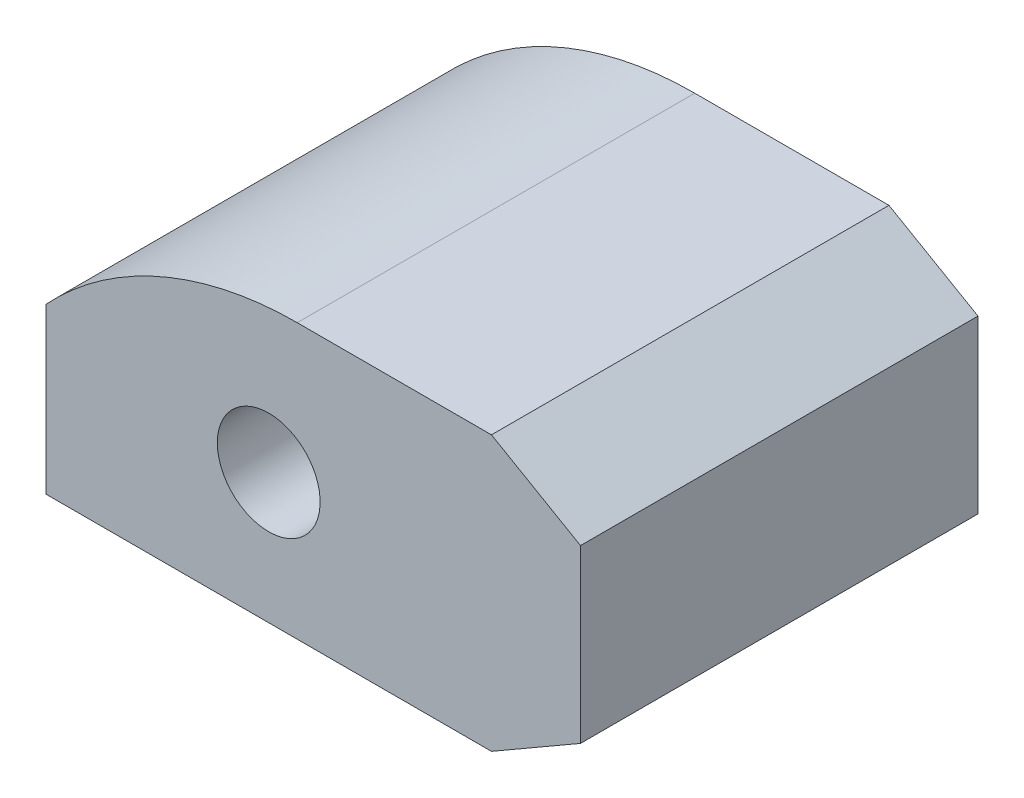
ISO-10303-21;
HEADER;
FILE_DESCRIPTION(('STEP AP214'),'2;1');
FILE_NAME('part.step','',(''),(''),'','','');
FILE_SCHEMA(('AUTOMOTIVE_DESIGN { 1 0 10303 214 1 1 1 1 }'));
ENDSEC;
DATA;
#1=APPLICATION_CONTEXT('core data for automotive mechanical design processes');
#2=APPLICATION_PROTOCOL_DEFINITION('international standard','automotive_design',2000,#1);
#3=PRODUCT_CONTEXT('',#1,'mechanical');
#4=PRODUCT('Part','Part','',(#3));
#5=PRODUCT_RELATED_PRODUCT_CATEGORY('part','',(#4));
#6=PRODUCT_DEFINITION_FORMATION('','',#4);
#7=PRODUCT_DEFINITION_CONTEXT('part definition',#1,'design');
#8=PRODUCT_DEFINITION('design','',#6,#7);
#9=PRODUCT_DEFINITION_SHAPE('','',#8);
#10=(LENGTH_UNIT() NAMED_UNIT(*) SI_UNIT(.MILLI.,.METRE.));
#11=(NAMED_UNIT(*) PLANE_ANGLE_UNIT() SI_UNIT($,.RADIAN.));
#12=(NAMED_UNIT(*) SI_UNIT($,.STERADIAN.) SOLID_ANGLE_UNIT());
#13=UNCERTAINTY_MEASURE_WITH_UNIT(LENGTH_MEASURE(1.E-05),#10,'distance_accuracy_value','');
#14=(GEOMETRIC_REPRESENTATION_CONTEXT(3) GLOBAL_UNCERTAINTY_ASSIGNED_CONTEXT((#13)) GLOBAL_UNIT_ASSIGNED_CONTEXT((#10,
#11,#12)) REPRESENTATION_CONTEXT('',''));
#15=CARTESIAN_POINT('',(0.,0.,0.));
#16=DIRECTION('',(0.,0.,1.));
#17=DIRECTION('',(1.,0.,0.));
#18=AXIS2_PLACEMENT_3D('',#15,#16,#17);
#19=CARTESIAN_POINT('',(4.16060555964673,-29.,58.));
#20=DIRECTION('',(0.,0.,-1.));
#21=DIRECTION('',(-1.,0.,0.));
#22=AXIS2_PLACEMENT_3D('',#19,#20,#21);
#23=PLANE('',#22);
#24=CARTESIAN_POINT('',(4.16060555964673,-29.,58.));
#25=DIRECTION('',(0.,0.,1.));
#26=DIRECTION('',(-1.,0.,0.));
#27=AXIS2_PLACEMENT_3D('',#24,#25,#26);
#28=CIRCLE('',#27,50.);
#29=CARTESIAN_POINT('',(4.16060555964673,21.,58.));
#30=VERTEX_POINT('',#29);
#31=CARTESIAN_POINT('',(-32.5,5.,58.));
#32=VERTEX_POINT('',#31);
#33=EDGE_CURVE('E161',#30,#32,#28,.T.);
#34=ORIENTED_EDGE('',*,*,#33,.T.);
#35=DIRECTION('',(0.,-1.,0.));
#36=VECTOR('',#35,1.);
#37=CARTESIAN_POINT('',(-32.5,-19.,58.));
#38=LINE('',#37,#36);
#39=CARTESIAN_POINT('',(-32.5,-19.,58.));
#40=VERTEX_POINT('',#39);
#41=EDGE_CURVE('E103',#32,#40,#38,.T.);
#42=ORIENTED_EDGE('',*,*,#41,.T.);
#43=DIRECTION('',(1.,0.,0.));
#44=VECTOR('',#43,1.);
#45=CARTESIAN_POINT('',(32.5,-19.,58.));
#46=LINE('',#45,#44);
#47=CARTESIAN_POINT('',(32.5,-19.,58.));
#48=VERTEX_POINT('',#47);
#49=EDGE_CURVE('E178',#40,#48,#46,.T.);
#50=ORIENTED_EDGE('',*,*,#49,.T.);
#51=DIRECTION('',(0.866025403784438,0.500000000000001,0.));
#52=VECTOR('',#51,1.);
#53=CARTESIAN_POINT('',(32.5,-19.,58.));
#54=LINE('',#53,#52);
#55=CARTESIAN_POINT('',(45.4903810567666,-11.5,58.));
#56=VERTEX_POINT('',#55);
#57=EDGE_CURVE('E119',#48,#56,#54,.T.);
#58=ORIENTED_EDGE('',*,*,#57,.T.);
#59=DIRECTION('',(0.,1.,0.));
#60=VECTOR('',#59,1.);
#61=CARTESIAN_POINT('',(45.4903810567666,-11.5,58.));
#62=LINE('',#61,#60);
#63=CARTESIAN_POINT('',(45.4903810567666,13.5000000000001,58.));
#64=VERTEX_POINT('',#63);
#65=EDGE_CURVE('E113',#56,#64,#62,.T.);
#66=ORIENTED_EDGE('',*,*,#65,.T.);
#67=DIRECTION('',(-0.866025403784442,0.499999999999995,0.));
#68=VECTOR('',#67,1.);
#69=CARTESIAN_POINT('',(45.4903810567666,13.5000000000001,58.));
#70=LINE('',#69,#68);
#71=CARTESIAN_POINT('',(32.5,21.,58.));
#72=VERTEX_POINT('',#71);
#73=EDGE_CURVE('E117',#64,#72,#70,.T.);
#74=ORIENTED_EDGE('',*,*,#73,.T.);
#75=DIRECTION('',(-1.,0.,0.));
#76=VECTOR('',#75,1.);
#77=CARTESIAN_POINT('',(32.5,21.,58.));
#78=LINE('',#77,#76);
#79=EDGE_CURVE('E63',#72,#30,#78,.T.);
#80=ORIENTED_EDGE('',*,*,#79,.T.);
#81=EDGE_LOOP('',(#34,#42,#50,#58,#66,#74,#80));
#82=FACE_BOUND('',#81,.T.);
#83=CARTESIAN_POINT('',(0.,0.,58.));
#84=DIRECTION('',(0.,0.,1.));
#85=DIRECTION('',(1.,0.,0.));
#86=AXIS2_PLACEMENT_3D('',#83,#84,#85);
#87=CIRCLE('',#86,7.5);
#88=CARTESIAN_POINT('',(-7.5,0.,58.));
#89=VERTEX_POINT('',#88);
#90=EDGE_CURVE('E146',#89,#89,#87,.T.);
#91=ORIENTED_EDGE('',*,*,#90,.F.);
#92=EDGE_LOOP('',(#91));
#93=FACE_BOUND('',#92,.T.);
#94=ADVANCED_FACE('F45',(#82,#93),#23,.F.);
#95=CARTESIAN_POINT('',(4.16060555964673,-29.,0.));
#96=DIRECTION('',(0.,0.,-1.));
#97=DIRECTION('',(-1.,0.,0.));
#98=AXIS2_PLACEMENT_3D('',#95,#96,#97);
#99=PLANE('',#98);
#100=CARTESIAN_POINT('',(4.16060555964673,-29.,0.));
#101=DIRECTION('',(0.,0.,1.));
#102=DIRECTION('',(-1.,0.,0.));
#103=AXIS2_PLACEMENT_3D('',#100,#101,#102);
#104=CIRCLE('',#103,50.);
#105=CARTESIAN_POINT('',(4.16060555964673,21.,0.));
#106=VERTEX_POINT('',#105);
#107=CARTESIAN_POINT('',(-32.5,5.,0.));
#108=VERTEX_POINT('',#107);
#109=EDGE_CURVE('E141',#106,#108,#104,.T.);
#110=ORIENTED_EDGE('',*,*,#109,.F.);
#111=DIRECTION('',(-1.,0.,0.));
#112=VECTOR('',#111,1.);
#113=CARTESIAN_POINT('',(32.5,21.,0.));
#114=LINE('',#113,#112);
#115=CARTESIAN_POINT('',(32.5,21.,0.));
#116=VERTEX_POINT('',#115);
#117=EDGE_CURVE('E95',#116,#106,#114,.T.);
#118=ORIENTED_EDGE('',*,*,#117,.F.);
#119=DIRECTION('',(-0.866025403784442,0.499999999999995,0.));
#120=VECTOR('',#119,1.);
#121=CARTESIAN_POINT('',(45.4903810567666,13.5000000000001,0.));
#122=LINE('',#121,#120);
#123=CARTESIAN_POINT('',(45.4903810567666,13.5000000000001,0.));
#124=VERTEX_POINT('',#123);
#125=EDGE_CURVE('E89',#124,#116,#122,.T.);
#126=ORIENTED_EDGE('',*,*,#125,.F.);
#127=DIRECTION('',(0.,1.,0.));
#128=VECTOR('',#127,1.);
#129=CARTESIAN_POINT('',(45.4903810567666,-11.5,0.));
#130=LINE('',#129,#128);
#131=CARTESIAN_POINT('',(45.4903810567666,-11.5,0.));
#132=VERTEX_POINT('',#131);
#133=EDGE_CURVE('E128',#132,#124,#130,.T.);
#134=ORIENTED_EDGE('',*,*,#133,.F.);
#135=DIRECTION('',(0.866025403784438,0.500000000000001,0.));
#136=VECTOR('',#135,1.);
#137=CARTESIAN_POINT('',(32.5,-19.,0.));
#138=LINE('',#137,#136);
#139=CARTESIAN_POINT('',(32.5,-19.,0.));
#140=VERTEX_POINT('',#139);
#141=EDGE_CURVE('E152',#140,#132,#138,.T.);
#142=ORIENTED_EDGE('',*,*,#141,.F.);
#143=DIRECTION('',(1.,0.,0.));
#144=VECTOR('',#143,1.);
#145=CARTESIAN_POINT('',(32.5,-19.,0.));
#146=LINE('',#145,#144);
#147=CARTESIAN_POINT('',(-32.5,-19.,0.));
#148=VERTEX_POINT('',#147);
#149=EDGE_CURVE('E149',#148,#140,#146,.T.);
#150=ORIENTED_EDGE('',*,*,#149,.F.);
#151=DIRECTION('',(0.,-1.,0.));
#152=VECTOR('',#151,1.);
#153=CARTESIAN_POINT('',(-32.5,-19.,0.));
#154=LINE('',#153,#152);
#155=EDGE_CURVE('E145',#108,#148,#154,.T.);
#156=ORIENTED_EDGE('',*,*,#155,.F.);
#157=EDGE_LOOP('',(#110,#118,#126,#134,#142,#150,#156));
#158=FACE_BOUND('',#157,.T.);
#159=CARTESIAN_POINT('',(0.,0.,0.));
#160=DIRECTION('',(0.,0.,1.));
#161=DIRECTION('',(1.,0.,0.));
#162=AXIS2_PLACEMENT_3D('',#159,#160,#161);
#163=CIRCLE('',#162,7.5);
#164=CARTESIAN_POINT('',(-7.5,0.,0.));
#165=VERTEX_POINT('',#164);
#166=EDGE_CURVE('E194',#165,#165,#163,.T.);
#167=ORIENTED_EDGE('',*,*,#166,.T.);
#168=EDGE_LOOP('',(#167));
#169=FACE_BOUND('',#168,.T.);
#170=ADVANCED_FACE('F182',(#158,#169),#99,.T.);
#171=CARTESIAN_POINT('',(4.16060555964673,-29.,58.));
#172=DIRECTION('',(0.,0.,-1.));
#173=DIRECTION('',(-1.,0.,0.));
#174=AXIS2_PLACEMENT_3D('',#171,#172,#173);
#175=CYLINDRICAL_SURFACE('',#174,50.);
#176=ORIENTED_EDGE('',*,*,#109,.T.);
#177=DIRECTION('',(0.,0.,-1.));
#178=VECTOR('',#177,1.);
#179=CARTESIAN_POINT('',(-32.5,5.,58.));
#180=LINE('',#179,#178);
#181=EDGE_CURVE('E11',#32,#108,#180,.T.);
#182=ORIENTED_EDGE('',*,*,#181,.F.);
#183=ORIENTED_EDGE('',*,*,#33,.F.);
#184=DIRECTION('',(0.,0.,-1.));
#185=VECTOR('',#184,1.);
#186=CARTESIAN_POINT('',(4.16060555964673,21.,58.));
#187=LINE('',#186,#185);
#188=EDGE_CURVE('E137',#30,#106,#187,.T.);
#189=ORIENTED_EDGE('',*,*,#188,.T.);
#190=EDGE_LOOP('',(#176,#182,#183,#189));
#191=FACE_BOUND('',#190,.T.);
#192=ADVANCED_FACE('F47',(#191),#175,.T.);
#193=CARTESIAN_POINT('',(-32.5,-19.,58.));
#194=DIRECTION('',(1.,0.,0.));
#195=DIRECTION('',(0.,0.,-1.));
#196=AXIS2_PLACEMENT_3D('',#193,#194,#195);
#197=PLANE('',#196);
#198=ORIENTED_EDGE('',*,*,#155,.T.);
#199=DIRECTION('',(0.,0.,-1.));
#200=VECTOR('',#199,1.);
#201=CARTESIAN_POINT('',(-32.5,-19.,58.));
#202=LINE('',#201,#200);
#203=EDGE_CURVE('E55',#40,#148,#202,.T.);
#204=ORIENTED_EDGE('',*,*,#203,.F.);
#205=ORIENTED_EDGE('',*,*,#41,.F.);
#206=ORIENTED_EDGE('',*,*,#181,.T.);
#207=EDGE_LOOP('',(#198,#204,#205,#206));
#208=FACE_BOUND('',#207,.T.);
#209=ADVANCED_FACE('F222',(#208),#197,.F.);
#210=CARTESIAN_POINT('',(32.5,-19.,58.));
#211=DIRECTION('',(0.,1.,0.));
#212=DIRECTION('',(-1.,0.,0.));
#213=AXIS2_PLACEMENT_3D('',#210,#211,#212);
#214=PLANE('',#213);
#215=ORIENTED_EDGE('',*,*,#149,.T.);
#216=DIRECTION('',(0.,0.,-1.));
#217=VECTOR('',#216,1.);
#218=CARTESIAN_POINT('',(32.5,-19.,58.));
#219=LINE('',#218,#217);
#220=EDGE_CURVE('E168',#48,#140,#219,.T.);
#221=ORIENTED_EDGE('',*,*,#220,.F.);
#222=ORIENTED_EDGE('',*,*,#49,.F.);
#223=ORIENTED_EDGE('',*,*,#203,.T.);
#224=EDGE_LOOP('',(#215,#221,#222,#223));
#225=FACE_BOUND('',#224,.T.);
#226=ADVANCED_FACE('F176',(#225),#214,.F.);
#227=CARTESIAN_POINT('',(32.5,-19.,58.));
#228=DIRECTION('',(-0.500000000000001,0.866025403784438,0.));
#229=DIRECTION('',(-0.866025403784438,-0.500000000000001,0.));
#230=AXIS2_PLACEMENT_3D('',#227,#228,#229);
#231=PLANE('',#230);
#232=ORIENTED_EDGE('',*,*,#141,.T.);
#233=DIRECTION('',(0.,0.,-1.));
#234=VECTOR('',#233,1.);
#235=CARTESIAN_POINT('',(45.4903810567666,-11.5,58.));
#236=LINE('',#235,#234);
#237=EDGE_CURVE('E130',#56,#132,#236,.T.);
#238=ORIENTED_EDGE('',*,*,#237,.F.);
#239=ORIENTED_EDGE('',*,*,#57,.F.);
#240=ORIENTED_EDGE('',*,*,#220,.T.);
#241=EDGE_LOOP('',(#232,#238,#239,#240));
#242=FACE_BOUND('',#241,.T.);
#243=ADVANCED_FACE('F185',(#242),#231,.F.);
#244=CARTESIAN_POINT('',(45.4903810567666,-11.5,58.));
#245=DIRECTION('',(-1.,0.,0.));
#246=DIRECTION('',(0.,0.,1.));
#247=AXIS2_PLACEMENT_3D('',#244,#245,#246);
#248=PLANE('',#247);
#249=ORIENTED_EDGE('',*,*,#133,.T.);
#250=DIRECTION('',(0.,0.,-1.));
#251=VECTOR('',#250,1.);
#252=CARTESIAN_POINT('',(45.4903810567666,13.5000000000001,58.));
#253=LINE('',#252,#251);
#254=EDGE_CURVE('E125',#64,#124,#253,.T.);
#255=ORIENTED_EDGE('',*,*,#254,.F.);
#256=ORIENTED_EDGE('',*,*,#65,.F.);
#257=ORIENTED_EDGE('',*,*,#237,.T.);
#258=EDGE_LOOP('',(#249,#255,#256,#257));
#259=FACE_BOUND('',#258,.T.);
#260=ADVANCED_FACE('F126',(#259),#248,.F.);
#261=CARTESIAN_POINT('',(45.4903810567666,13.5000000000001,58.));
#262=DIRECTION('',(-0.499999999999995,-0.866025403784442,0.));
#263=DIRECTION('',(0.866025403784442,-0.499999999999995,0.));
#264=AXIS2_PLACEMENT_3D('',#261,#262,#263);
#265=PLANE('',#264);
#266=ORIENTED_EDGE('',*,*,#125,.T.);
#267=DIRECTION('',(0.,0.,-1.));
#268=VECTOR('',#267,1.);
#269=CARTESIAN_POINT('',(32.5,21.,58.));
#270=LINE('',#269,#268);
#271=EDGE_CURVE('E131',#72,#116,#270,.T.);
#272=ORIENTED_EDGE('',*,*,#271,.F.);
#273=ORIENTED_EDGE('',*,*,#73,.F.);
#274=ORIENTED_EDGE('',*,*,#254,.T.);
#275=EDGE_LOOP('',(#266,#272,#273,#274));
#276=FACE_BOUND('',#275,.T.);
#277=ADVANCED_FACE('F133',(#276),#265,.F.);
#278=CARTESIAN_POINT('',(32.5,21.,58.));
#279=DIRECTION('',(0.,-1.,0.));
#280=DIRECTION('',(1.,0.,0.));
#281=AXIS2_PLACEMENT_3D('',#278,#279,#280);
#282=PLANE('',#281);
#283=ORIENTED_EDGE('',*,*,#117,.T.);
#284=ORIENTED_EDGE('',*,*,#188,.F.);
#285=ORIENTED_EDGE('',*,*,#79,.F.);
#286=ORIENTED_EDGE('',*,*,#271,.T.);
#287=EDGE_LOOP('',(#283,#284,#285,#286));
#288=FACE_BOUND('',#287,.T.);
#289=ADVANCED_FACE('F212',(#288),#282,.F.);
#290=CARTESIAN_POINT('',(0.,0.,58.));
#291=DIRECTION('',(0.,0.,-1.));
#292=DIRECTION('',(-1.,0.,0.));
#293=AXIS2_PLACEMENT_3D('',#290,#291,#292);
#294=CYLINDRICAL_SURFACE('',#293,7.5);
#295=CARTESIAN_POINT('',(-7.5,0.,58.));
#296=CARTESIAN_POINT('',(-7.5,0.,57.3958333333333));
#297=CARTESIAN_POINT('',(-7.5,0.,56.7916666666667));
#298=CARTESIAN_POINT('',(-7.5,0.,55.5833333333333));
#299=CARTESIAN_POINT('',(-7.5,0.,54.9791666666667));
#300=CARTESIAN_POINT('',(-7.5,0.,53.7708333333333));
#301=CARTESIAN_POINT('',(-7.5,0.,53.1666666666667));
#302=CARTESIAN_POINT('',(-7.5,0.,51.9583333333333));
#303=CARTESIAN_POINT('',(-7.5,0.,51.3541666666667));
#304=CARTESIAN_POINT('',(-7.5,0.,50.1458333333333));
#305=CARTESIAN_POINT('',(-7.5,0.,49.5416666666667));
#306=CARTESIAN_POINT('',(-7.5,0.,48.3333333333333));
#307=CARTESIAN_POINT('',(-7.5,0.,47.7291666666667));
#308=CARTESIAN_POINT('',(-7.5,0.,46.5208333333333));
#309=CARTESIAN_POINT('',(-7.5,0.,45.9166666666667));
#310=CARTESIAN_POINT('',(-7.5,0.,44.7083333333333));
#311=CARTESIAN_POINT('',(-7.5,0.,44.1041666666667));
#312=CARTESIAN_POINT('',(-7.5,0.,42.8958333333333));
#313=CARTESIAN_POINT('',(-7.5,0.,42.2916666666667));
#314=CARTESIAN_POINT('',(-7.5,0.,41.0833333333333));
#315=CARTESIAN_POINT('',(-7.5,0.,40.4791666666667));
#316=CARTESIAN_POINT('',(-7.5,0.,39.2708333333333));
#317=CARTESIAN_POINT('',(-7.5,0.,38.6666666666667));
#318=CARTESIAN_POINT('',(-7.5,0.,37.4583333333333));
#319=CARTESIAN_POINT('',(-7.5,0.,36.8541666666667));
#320=CARTESIAN_POINT('',(-7.5,0.,35.6458333333333));
#321=CARTESIAN_POINT('',(-7.5,0.,35.0416666666667));
#322=CARTESIAN_POINT('',(-7.5,0.,33.8333333333333));
#323=CARTESIAN_POINT('',(-7.5,0.,33.2291666666667));
#324=CARTESIAN_POINT('',(-7.5,0.,32.0208333333333));
#325=CARTESIAN_POINT('',(-7.5,0.,31.4166666666667));
#326=CARTESIAN_POINT('',(-7.5,0.,30.2083333333333));
#327=CARTESIAN_POINT('',(-7.5,0.,29.6041666666667));
#328=CARTESIAN_POINT('',(-7.5,0.,28.3958333333333));
#329=CARTESIAN_POINT('',(-7.5,0.,27.7916666666667));
#330=CARTESIAN_POINT('',(-7.5,0.,26.5833333333333));
#331=CARTESIAN_POINT('',(-7.5,0.,25.9791666666667));
#332=CARTESIAN_POINT('',(-7.5,0.,24.7708333333333));
#333=CARTESIAN_POINT('',(-7.5,0.,24.1666666666667));
#334=CARTESIAN_POINT('',(-7.5,0.,22.9583333333333));
#335=CARTESIAN_POINT('',(-7.5,0.,22.3541666666667));
#336=CARTESIAN_POINT('',(-7.5,0.,21.1458333333333));
#337=CARTESIAN_POINT('',(-7.5,0.,20.5416666666667));
#338=CARTESIAN_POINT('',(-7.5,0.,19.3333333333333));
#339=CARTESIAN_POINT('',(-7.5,0.,18.7291666666667));
#340=CARTESIAN_POINT('',(-7.5,0.,17.5208333333333));
#341=CARTESIAN_POINT('',(-7.5,0.,16.9166666666667));
#342=CARTESIAN_POINT('',(-7.5,0.,15.7083333333333));
#343=CARTESIAN_POINT('',(-7.5,0.,15.1041666666667));
#344=CARTESIAN_POINT('',(-7.5,0.,13.8958333333333));
#345=CARTESIAN_POINT('',(-7.5,0.,13.2916666666667));
#346=CARTESIAN_POINT('',(-7.5,0.,12.0833333333333));
#347=CARTESIAN_POINT('',(-7.5,0.,11.4791666666667));
#348=CARTESIAN_POINT('',(-7.5,0.,10.2708333333333));
#349=CARTESIAN_POINT('',(-7.5,0.,9.66666666666667));
#350=CARTESIAN_POINT('',(-7.5,0.,8.45833333333333));
#351=CARTESIAN_POINT('',(-7.5,0.,7.85416666666667));
#352=CARTESIAN_POINT('',(-7.5,0.,6.64583333333333));
#353=CARTESIAN_POINT('',(-7.5,0.,6.04166666666667));
#354=CARTESIAN_POINT('',(-7.5,0.,4.83333333333333));
#355=CARTESIAN_POINT('',(-7.5,0.,4.22916666666667));
#356=CARTESIAN_POINT('',(-7.5,0.,3.02083333333334));
#357=CARTESIAN_POINT('',(-7.5,0.,2.41666666666667));
#358=CARTESIAN_POINT('',(-7.5,0.,1.20833333333333));
#359=CARTESIAN_POINT('',(-7.5,0.,0.604166666666666));
#360=CARTESIAN_POINT('',(-7.5,0.,0.));
#361=B_SPLINE_CURVE_WITH_KNOTS('',3,(#295,#296,#297,#298,#299,#300,#301,#302,#303,#304,#305,
#306,#307,#308,#309,#310,#311,#312,#313,#314,#315,#316,#317,#318,#319,#320,#321,#322,#323,#324,
#325,#326,#327,#328,#329,#330,#331,#332,#333,#334,#335,#336,#337,#338,#339,#340,#341,#342,#343,
#344,#345,#346,#347,#348,#349,#350,#351,#352,#353,#354,#355,#356,#357,#358,#359,#360),
.UNSPECIFIED.,.F.,.F.,(4,2,2,2,2,2,2,2,2,2,2,2,2,2,2,2,2,2,2,2,2,2,2,2,2,2,2,2,2,2,2,2,4),(0.,
1.8125,3.625,5.4375,7.25000000000001,9.0625,10.875,12.6875,14.5,16.3125,18.125,19.9375,21.75,
23.5625,25.375,27.1875,29.,30.8125,32.625,34.4375,36.25,38.0625,39.875,41.6875,43.5,45.3125,
47.125,48.9375,50.75,52.5625,54.375,56.1875,58.),.UNSPECIFIED.);
#362=EDGE_CURVE('BSEAM202',#89,#165,#361,.T.);
#363=ORIENTED_EDGE('',*,*,#90,.T.);
#364=ORIENTED_EDGE('',*,*,#166,.F.);
#365=ORIENTED_EDGE('',*,*,#362,.T.);
#366=ORIENTED_EDGE('',*,*,#362,.F.);
#367=EDGE_LOOP('',(#363,#365,#364,#366));
#368=FACE_BOUND('',#367,.T.);
#369=ADVANCED_FACE('F202',(#368),#294,.F.);
#370=CLOSED_SHELL('',(#94,#170,#192,#209,#226,#243,#260,#277,#289,#369));
#371=MANIFOLD_SOLID_BREP('B2',#370);
#372=ADVANCED_BREP_SHAPE_REPRESENTATION('',(#18,#371),#14);
#373=SHAPE_DEFINITION_REPRESENTATION(#9,#372);
ENDSEC;
END-ISO-10303-21;
